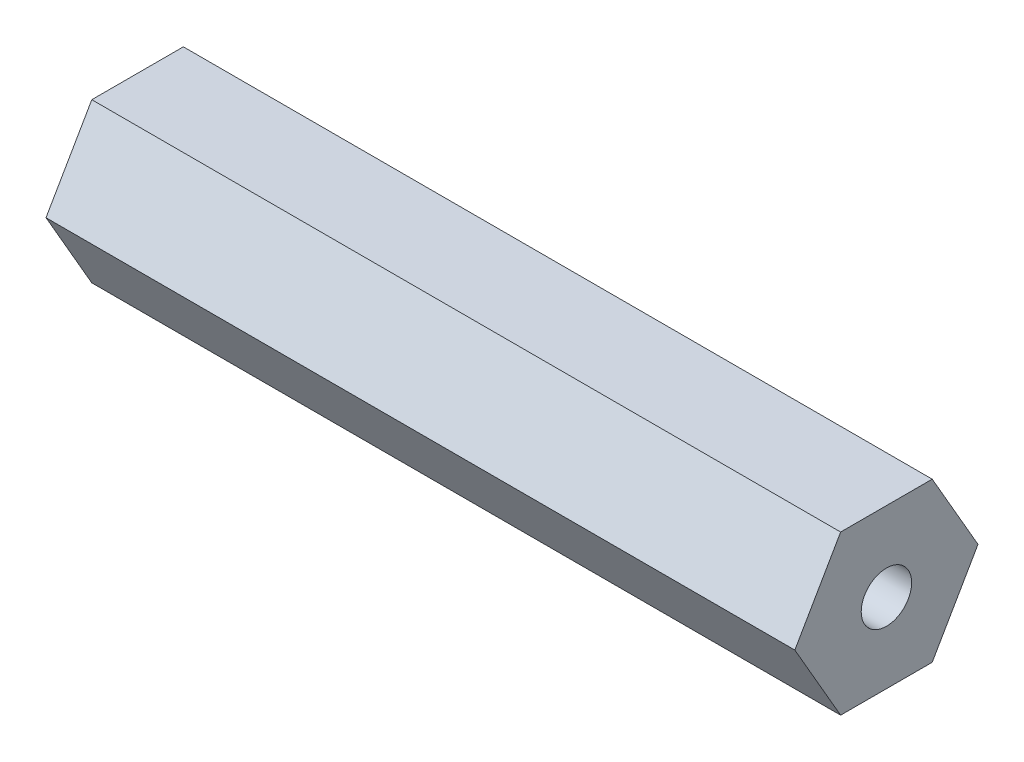
ISO-10303-21;
HEADER;
FILE_DESCRIPTION(('STEP AP214'),'2;1');
FILE_NAME('part.step','',(''),(''),'','','');
FILE_SCHEMA(('AUTOMOTIVE_DESIGN { 1 0 10303 214 1 1 1 1 }'));
ENDSEC;
DATA;
#1=APPLICATION_CONTEXT('core data for automotive mechanical design processes');
#2=APPLICATION_PROTOCOL_DEFINITION('international standard','automotive_design',2000,#1);
#3=PRODUCT_CONTEXT('',#1,'mechanical');
#4=PRODUCT('Part','Part','',(#3));
#5=PRODUCT_RELATED_PRODUCT_CATEGORY('part','',(#4));
#6=PRODUCT_DEFINITION_FORMATION('','',#4);
#7=PRODUCT_DEFINITION_CONTEXT('part definition',#1,'design');
#8=PRODUCT_DEFINITION('design','',#6,#7);
#9=PRODUCT_DEFINITION_SHAPE('','',#8);
#10=(LENGTH_UNIT() NAMED_UNIT(*) SI_UNIT(.MILLI.,.METRE.));
#11=(NAMED_UNIT(*) PLANE_ANGLE_UNIT() SI_UNIT($,.RADIAN.));
#12=(NAMED_UNIT(*) SI_UNIT($,.STERADIAN.) SOLID_ANGLE_UNIT());
#13=UNCERTAINTY_MEASURE_WITH_UNIT(LENGTH_MEASURE(1.E-05),#10,'distance_accuracy_value','');
#14=(GEOMETRIC_REPRESENTATION_CONTEXT(3) GLOBAL_UNCERTAINTY_ASSIGNED_CONTEXT((#13)) GLOBAL_UNIT_ASSIGNED_CONTEXT((#10,
#11,#12)) REPRESENTATION_CONTEXT('',''));
#15=CARTESIAN_POINT('',(0.,0.,0.));
#16=DIRECTION('',(0.,0.,1.));
#17=DIRECTION('',(1.,0.,0.));
#18=AXIS2_PLACEMENT_3D('',#15,#16,#17);
#19=CARTESIAN_POINT('',(59.9567,0.,0.));
#20=DIRECTION('',(1.,0.,0.));
#21=DIRECTION('',(0.,0.,-1.));
#22=AXIS2_PLACEMENT_3D('',#19,#20,#21);
#23=PLANE('',#22);
#24=DIRECTION('',(0.,0.866025403784442,-0.499999999999994));
#25=VECTOR('',#24,1.);
#26=CARTESIAN_POINT('',(59.9567,-6.34999999999998,-3.66617420935417));
#27=LINE('',#26,#25);
#28=CARTESIAN_POINT('',(59.9567,-6.34999999999998,-3.66617420935417));
#29=VERTEX_POINT('',#28);
#30=CARTESIAN_POINT('',(59.9567,0.,-7.33234841870825));
#31=VERTEX_POINT('',#30);
#32=EDGE_CURVE('E129',#29,#31,#27,.T.);
#33=ORIENTED_EDGE('',*,*,#32,.T.);
#34=DIRECTION('',(0.,0.866025403784435,0.500000000000006));
#35=VECTOR('',#34,1.);
#36=CARTESIAN_POINT('',(59.9567,0.,-7.33234841870825));
#37=LINE('',#36,#35);
#38=CARTESIAN_POINT('',(59.9567,6.35000000000002,-3.66617420935408));
#39=VERTEX_POINT('',#38);
#40=EDGE_CURVE('E87',#31,#39,#37,.T.);
#41=ORIENTED_EDGE('',*,*,#40,.T.);
#42=DIRECTION('',(0.,0.,1.));
#43=VECTOR('',#42,1.);
#44=CARTESIAN_POINT('',(59.9567,6.35000000000002,-3.66617420935408));
#45=LINE('',#44,#43);
#46=CARTESIAN_POINT('',(59.9567,6.34999999999997,3.66617420935417));
#47=VERTEX_POINT('',#46);
#48=EDGE_CURVE('E100',#39,#47,#45,.T.);
#49=ORIENTED_EDGE('',*,*,#48,.T.);
#50=DIRECTION('',(0.,-0.866025403784442,0.499999999999994));
#51=VECTOR('',#50,1.);
#52=CARTESIAN_POINT('',(59.9567,6.34999999999997,3.66617420935417));
#53=LINE('',#52,#51);
#54=CARTESIAN_POINT('',(59.9567,0.,7.33234841870825));
#55=VERTEX_POINT('',#54);
#56=EDGE_CURVE('E94',#47,#55,#53,.T.);
#57=ORIENTED_EDGE('',*,*,#56,.T.);
#58=DIRECTION('',(0.,-0.866025403784435,-0.500000000000006));
#59=VECTOR('',#58,1.);
#60=CARTESIAN_POINT('',(59.9567,0.,7.33234841870825));
#61=LINE('',#60,#59);
#62=CARTESIAN_POINT('',(59.9567,-6.35000000000003,3.66617420935408));
#63=VERTEX_POINT('',#62);
#64=EDGE_CURVE('E98',#55,#63,#61,.T.);
#65=ORIENTED_EDGE('',*,*,#64,.T.);
#66=DIRECTION('',(0.,0.,-1.));
#67=VECTOR('',#66,1.);
#68=CARTESIAN_POINT('',(59.9567,-6.35000000000003,3.66617420935408));
#69=LINE('',#68,#67);
#70=EDGE_CURVE('E50',#63,#29,#69,.T.);
#71=ORIENTED_EDGE('',*,*,#70,.T.);
#72=EDGE_LOOP('',(#33,#41,#49,#57,#65,#71));
#73=FACE_BOUND('',#72,.T.);
#74=CARTESIAN_POINT('',(59.9567,0.,0.));
#75=DIRECTION('',(1.,0.,0.));
#76=DIRECTION('',(0.,0.,-1.));
#77=AXIS2_PLACEMENT_3D('',#74,#75,#76);
#78=CIRCLE('',#77,2.0193);
#79=CARTESIAN_POINT('',(59.9567,0.,2.0193));
#80=VERTEX_POINT('',#79);
#81=EDGE_CURVE('E122',#80,#80,#78,.T.);
#82=ORIENTED_EDGE('',*,*,#81,.F.);
#83=EDGE_LOOP('',(#82));
#84=FACE_BOUND('',#83,.T.);
#85=ADVANCED_FACE('F33',(#73,#84),#23,.T.);
#86=CARTESIAN_POINT('',(0.,0.,0.));
#87=DIRECTION('',(1.,0.,0.));
#88=DIRECTION('',(0.,0.,-1.));
#89=AXIS2_PLACEMENT_3D('',#86,#87,#88);
#90=PLANE('',#89);
#91=DIRECTION('',(0.,0.866025403784442,-0.499999999999994));
#92=VECTOR('',#91,1.);
#93=CARTESIAN_POINT('',(0.,-6.34999999999998,-3.66617420935417));
#94=LINE('',#93,#92);
#95=CARTESIAN_POINT('',(0.,-6.34999999999998,-3.66617420935417));
#96=VERTEX_POINT('',#95);
#97=CARTESIAN_POINT('',(0.,0.,-7.33234841870825));
#98=VERTEX_POINT('',#97);
#99=EDGE_CURVE('E118',#96,#98,#94,.T.);
#100=ORIENTED_EDGE('',*,*,#99,.F.);
#101=DIRECTION('',(0.,0.,-1.));
#102=VECTOR('',#101,1.);
#103=CARTESIAN_POINT('',(0.,-6.35000000000003,3.66617420935408));
#104=LINE('',#103,#102);
#105=CARTESIAN_POINT('',(0.,-6.35000000000003,3.66617420935408));
#106=VERTEX_POINT('',#105);
#107=EDGE_CURVE('E79',#106,#96,#104,.T.);
#108=ORIENTED_EDGE('',*,*,#107,.F.);
#109=DIRECTION('',(0.,-0.866025403784435,-0.500000000000006));
#110=VECTOR('',#109,1.);
#111=CARTESIAN_POINT('',(0.,0.,7.33234841870825));
#112=LINE('',#111,#110);
#113=CARTESIAN_POINT('',(0.,0.,7.33234841870825));
#114=VERTEX_POINT('',#113);
#115=EDGE_CURVE('E73',#114,#106,#112,.T.);
#116=ORIENTED_EDGE('',*,*,#115,.F.);
#117=DIRECTION('',(0.,-0.866025403784442,0.499999999999994));
#118=VECTOR('',#117,1.);
#119=CARTESIAN_POINT('',(0.,6.34999999999997,3.66617420935417));
#120=LINE('',#119,#118);
#121=CARTESIAN_POINT('',(0.,6.34999999999997,3.66617420935417));
#122=VERTEX_POINT('',#121);
#123=EDGE_CURVE('E108',#122,#114,#120,.T.);
#124=ORIENTED_EDGE('',*,*,#123,.F.);
#125=DIRECTION('',(0.,0.,1.));
#126=VECTOR('',#125,1.);
#127=CARTESIAN_POINT('',(0.,6.35000000000002,-3.66617420935408));
#128=LINE('',#127,#126);
#129=CARTESIAN_POINT('',(0.,6.35000000000002,-3.66617420935408));
#130=VERTEX_POINT('',#129);
#131=EDGE_CURVE('E124',#130,#122,#128,.T.);
#132=ORIENTED_EDGE('',*,*,#131,.F.);
#133=DIRECTION('',(0.,0.866025403784435,0.500000000000006));
#134=VECTOR('',#133,1.);
#135=CARTESIAN_POINT('',(0.,0.,-7.33234841870825));
#136=LINE('',#135,#134);
#137=EDGE_CURVE('E121',#98,#130,#136,.T.);
#138=ORIENTED_EDGE('',*,*,#137,.F.);
#139=EDGE_LOOP('',(#100,#108,#116,#124,#132,#138));
#140=FACE_BOUND('',#139,.T.);
#141=CARTESIAN_POINT('',(0.,0.,0.));
#142=DIRECTION('',(1.,0.,0.));
#143=DIRECTION('',(0.,0.,-1.));
#144=AXIS2_PLACEMENT_3D('',#141,#142,#143);
#145=CIRCLE('',#144,2.0193);
#146=CARTESIAN_POINT('',(0.,0.,2.0193));
#147=VERTEX_POINT('',#146);
#148=EDGE_CURVE('E222',#147,#147,#145,.T.);
#149=ORIENTED_EDGE('',*,*,#148,.T.);
#150=EDGE_LOOP('',(#149));
#151=FACE_BOUND('',#150,.T.);
#152=ADVANCED_FACE('F138',(#140,#151),#90,.F.);
#153=CARTESIAN_POINT('',(59.9567,-6.34999999999998,-3.66617420935417));
#154=DIRECTION('',(0.,0.499999999999994,0.866025403784442));
#155=DIRECTION('',(0.,-0.866025403784442,0.499999999999994));
#156=AXIS2_PLACEMENT_3D('',#153,#154,#155);
#157=PLANE('',#156);
#158=ORIENTED_EDGE('',*,*,#99,.T.);
#159=DIRECTION('',(-1.,0.,0.));
#160=VECTOR('',#159,1.);
#161=CARTESIAN_POINT('',(59.9567,0.,-7.33234841870825));
#162=LINE('',#161,#160);
#163=EDGE_CURVE('E11',#31,#98,#162,.T.);
#164=ORIENTED_EDGE('',*,*,#163,.F.);
#165=ORIENTED_EDGE('',*,*,#32,.F.);
#166=DIRECTION('',(-1.,0.,0.));
#167=VECTOR('',#166,1.);
#168=CARTESIAN_POINT('',(59.9567,-6.34999999999998,-3.66617420935417));
#169=LINE('',#168,#167);
#170=EDGE_CURVE('E114',#29,#96,#169,.T.);
#171=ORIENTED_EDGE('',*,*,#170,.T.);
#172=EDGE_LOOP('',(#158,#164,#165,#171));
#173=FACE_BOUND('',#172,.T.);
#174=ADVANCED_FACE('F35',(#173),#157,.F.);
#175=CARTESIAN_POINT('',(59.9567,0.,-7.33234841870825));
#176=DIRECTION('',(0.,-0.500000000000006,0.866025403784435));
#177=DIRECTION('',(0.,-0.866025403784435,-0.500000000000006));
#178=AXIS2_PLACEMENT_3D('',#175,#176,#177);
#179=PLANE('',#178);
#180=ORIENTED_EDGE('',*,*,#137,.T.);
#181=DIRECTION('',(-1.,0.,0.));
#182=VECTOR('',#181,1.);
#183=CARTESIAN_POINT('',(59.9567,6.35000000000002,-3.66617420935408));
#184=LINE('',#183,#182);
#185=EDGE_CURVE('E42',#39,#130,#184,.T.);
#186=ORIENTED_EDGE('',*,*,#185,.F.);
#187=ORIENTED_EDGE('',*,*,#40,.F.);
#188=ORIENTED_EDGE('',*,*,#163,.T.);
#189=EDGE_LOOP('',(#180,#186,#187,#188));
#190=FACE_BOUND('',#189,.T.);
#191=ADVANCED_FACE('F163',(#190),#179,.F.);
#192=CARTESIAN_POINT('',(59.9567,6.35000000000002,-3.66617420935408));
#193=DIRECTION('',(0.,-1.,0.));
#194=DIRECTION('',(0.,0.,-1.));
#195=AXIS2_PLACEMENT_3D('',#192,#193,#194);
#196=PLANE('',#195);
#197=ORIENTED_EDGE('',*,*,#131,.T.);
#198=DIRECTION('',(-1.,0.,0.));
#199=VECTOR('',#198,1.);
#200=CARTESIAN_POINT('',(59.9567,6.34999999999997,3.66617420935417));
#201=LINE('',#200,#199);
#202=EDGE_CURVE('E109',#47,#122,#201,.T.);
#203=ORIENTED_EDGE('',*,*,#202,.F.);
#204=ORIENTED_EDGE('',*,*,#48,.F.);
#205=ORIENTED_EDGE('',*,*,#185,.T.);
#206=EDGE_LOOP('',(#197,#203,#204,#205));
#207=FACE_BOUND('',#206,.T.);
#208=ADVANCED_FACE('F135',(#207),#196,.F.);
#209=CARTESIAN_POINT('',(59.9567,6.34999999999997,3.66617420935417));
#210=DIRECTION('',(0.,-0.499999999999994,-0.866025403784442));
#211=DIRECTION('',(0.,0.866025403784442,-0.499999999999994));
#212=AXIS2_PLACEMENT_3D('',#209,#210,#211);
#213=PLANE('',#212);
#214=ORIENTED_EDGE('',*,*,#123,.T.);
#215=DIRECTION('',(-1.,0.,0.));
#216=VECTOR('',#215,1.);
#217=CARTESIAN_POINT('',(59.9567,0.,7.33234841870825));
#218=LINE('',#217,#216);
#219=EDGE_CURVE('E105',#55,#114,#218,.T.);
#220=ORIENTED_EDGE('',*,*,#219,.F.);
#221=ORIENTED_EDGE('',*,*,#56,.F.);
#222=ORIENTED_EDGE('',*,*,#202,.T.);
#223=EDGE_LOOP('',(#214,#220,#221,#222));
#224=FACE_BOUND('',#223,.T.);
#225=ADVANCED_FACE('F106',(#224),#213,.F.);
#226=CARTESIAN_POINT('',(59.9567,0.,7.33234841870825));
#227=DIRECTION('',(0.,0.500000000000006,-0.866025403784435));
#228=DIRECTION('',(0.,0.866025403784435,0.500000000000006));
#229=AXIS2_PLACEMENT_3D('',#226,#227,#228);
#230=PLANE('',#229);
#231=ORIENTED_EDGE('',*,*,#115,.T.);
#232=DIRECTION('',(-1.,0.,0.));
#233=VECTOR('',#232,1.);
#234=CARTESIAN_POINT('',(59.9567,-6.35000000000003,3.66617420935408));
#235=LINE('',#234,#233);
#236=EDGE_CURVE('E110',#63,#106,#235,.T.);
#237=ORIENTED_EDGE('',*,*,#236,.F.);
#238=ORIENTED_EDGE('',*,*,#64,.F.);
#239=ORIENTED_EDGE('',*,*,#219,.T.);
#240=EDGE_LOOP('',(#231,#237,#238,#239));
#241=FACE_BOUND('',#240,.T.);
#242=ADVANCED_FACE('F112',(#241),#230,.F.);
#243=CARTESIAN_POINT('',(59.9567,-6.35000000000003,3.66617420935408));
#244=DIRECTION('',(0.,1.,0.));
#245=DIRECTION('',(0.,0.,1.));
#246=AXIS2_PLACEMENT_3D('',#243,#244,#245);
#247=PLANE('',#246);
#248=ORIENTED_EDGE('',*,*,#107,.T.);
#249=ORIENTED_EDGE('',*,*,#170,.F.);
#250=ORIENTED_EDGE('',*,*,#70,.F.);
#251=ORIENTED_EDGE('',*,*,#236,.T.);
#252=EDGE_LOOP('',(#248,#249,#250,#251));
#253=FACE_BOUND('',#252,.T.);
#254=ADVANCED_FACE('F143',(#253),#247,.F.);
#255=CARTESIAN_POINT('',(59.9567,0.,0.));
#256=DIRECTION('',(-1.,0.,0.));
#257=DIRECTION('',(0.,0.,1.));
#258=AXIS2_PLACEMENT_3D('',#255,#256,#257);
#259=CYLINDRICAL_SURFACE('',#258,2.0193);
#260=CARTESIAN_POINT('',(59.9567,0.,2.0193));
#261=CARTESIAN_POINT('',(59.3321510416667,0.,2.0193));
#262=CARTESIAN_POINT('',(58.7076020833333,0.,2.0193));
#263=CARTESIAN_POINT('',(57.4585041666667,0.,2.0193));
#264=CARTESIAN_POINT('',(56.8339552083333,0.,2.0193));
#265=CARTESIAN_POINT('',(55.5848572916667,0.,2.0193));
#266=CARTESIAN_POINT('',(54.9603083333333,0.,2.0193));
#267=CARTESIAN_POINT('',(53.7112104166667,0.,2.0193));
#268=CARTESIAN_POINT('',(53.0866614583333,0.,2.0193));
#269=CARTESIAN_POINT('',(51.8375635416667,0.,2.0193));
#270=CARTESIAN_POINT('',(51.2130145833333,0.,2.0193));
#271=CARTESIAN_POINT('',(49.9639166666667,0.,2.0193));
#272=CARTESIAN_POINT('',(49.3393677083333,0.,2.0193));
#273=CARTESIAN_POINT('',(48.0902697916667,0.,2.0193));
#274=CARTESIAN_POINT('',(47.4657208333333,0.,2.0193));
#275=CARTESIAN_POINT('',(46.2166229166667,0.,2.0193));
#276=CARTESIAN_POINT('',(45.5920739583333,0.,2.0193));
#277=CARTESIAN_POINT('',(44.3429760416667,0.,2.0193));
#278=CARTESIAN_POINT('',(43.7184270833333,0.,2.0193));
#279=CARTESIAN_POINT('',(42.4693291666667,0.,2.0193));
#280=CARTESIAN_POINT('',(41.8447802083333,0.,2.0193));
#281=CARTESIAN_POINT('',(40.5956822916667,0.,2.0193));
#282=CARTESIAN_POINT('',(39.9711333333333,0.,2.0193));
#283=CARTESIAN_POINT('',(38.7220354166667,0.,2.0193));
#284=CARTESIAN_POINT('',(38.0974864583333,0.,2.0193));
#285=CARTESIAN_POINT('',(36.8483885416667,0.,2.0193));
#286=CARTESIAN_POINT('',(36.2238395833333,0.,2.0193));
#287=CARTESIAN_POINT('',(34.9747416666667,0.,2.0193));
#288=CARTESIAN_POINT('',(34.3501927083333,0.,2.0193));
#289=CARTESIAN_POINT('',(33.1010947916667,0.,2.0193));
#290=CARTESIAN_POINT('',(32.4765458333333,0.,2.0193));
#291=CARTESIAN_POINT('',(31.2274479166667,0.,2.0193));
#292=CARTESIAN_POINT('',(30.6028989583333,0.,2.0193));
#293=CARTESIAN_POINT('',(29.3538010416667,0.,2.0193));
#294=CARTESIAN_POINT('',(28.7292520833333,0.,2.0193));
#295=CARTESIAN_POINT('',(27.4801541666667,0.,2.0193));
#296=CARTESIAN_POINT('',(26.8556052083333,0.,2.0193));
#297=CARTESIAN_POINT('',(25.6065072916667,0.,2.0193));
#298=CARTESIAN_POINT('',(24.9819583333333,0.,2.0193));
#299=CARTESIAN_POINT('',(23.7328604166667,0.,2.0193));
#300=CARTESIAN_POINT('',(23.1083114583333,0.,2.0193));
#301=CARTESIAN_POINT('',(21.8592135416667,0.,2.0193));
#302=CARTESIAN_POINT('',(21.2346645833333,0.,2.0193));
#303=CARTESIAN_POINT('',(19.9855666666667,0.,2.0193));
#304=CARTESIAN_POINT('',(19.3610177083333,0.,2.0193));
#305=CARTESIAN_POINT('',(18.1119197916667,0.,2.0193));
#306=CARTESIAN_POINT('',(17.4873708333333,0.,2.0193));
#307=CARTESIAN_POINT('',(16.2382729166667,0.,2.0193));
#308=CARTESIAN_POINT('',(15.6137239583333,0.,2.0193));
#309=CARTESIAN_POINT('',(14.3646260416667,0.,2.0193));
#310=CARTESIAN_POINT('',(13.7400770833333,0.,2.0193));
#311=CARTESIAN_POINT('',(12.4909791666667,0.,2.0193));
#312=CARTESIAN_POINT('',(11.8664302083333,0.,2.0193));
#313=CARTESIAN_POINT('',(10.6173322916667,0.,2.0193));
#314=CARTESIAN_POINT('',(9.99278333333333,0.,2.0193));
#315=CARTESIAN_POINT('',(8.74368541666666,0.,2.0193));
#316=CARTESIAN_POINT('',(8.11913645833333,0.,2.0193));
#317=CARTESIAN_POINT('',(6.87003854166666,0.,2.0193));
#318=CARTESIAN_POINT('',(6.24548958333333,0.,2.0193));
#319=CARTESIAN_POINT('',(4.99639166666666,0.,2.0193));
#320=CARTESIAN_POINT('',(4.37184270833333,0.,2.0193));
#321=CARTESIAN_POINT('',(3.12274479166666,0.,2.0193));
#322=CARTESIAN_POINT('',(2.49819583333333,0.,2.0193));
#323=CARTESIAN_POINT('',(1.24909791666666,0.,2.0193));
#324=CARTESIAN_POINT('',(0.624548958333327,0.,2.0193));
#325=CARTESIAN_POINT('',(0.,0.,2.0193));
#326=B_SPLINE_CURVE_WITH_KNOTS('',3,(#260,#261,#262,#263,#264,#265,#266,#267,#268,#269,#270,
#271,#272,#273,#274,#275,#276,#277,#278,#279,#280,#281,#282,#283,#284,#285,#286,#287,#288,#289,
#290,#291,#292,#293,#294,#295,#296,#297,#298,#299,#300,#301,#302,#303,#304,#305,#306,#307,#308,
#309,#310,#311,#312,#313,#314,#315,#316,#317,#318,#319,#320,#321,#322,#323,#324,#325),
.UNSPECIFIED.,.F.,.F.,(4,2,2,2,2,2,2,2,2,2,2,2,2,2,2,2,2,2,2,2,2,2,2,2,2,2,2,2,2,2,2,2,4),(0.,
1.873646875,3.74729375,5.62094062499999,7.4945875,9.368234375,11.24188125,13.115528125,
14.989175,16.862821875,18.73646875,20.610115625,22.4837625,24.357409375,26.23105625,
28.104703125,29.97835,31.851996875,33.72564375,35.599290625,37.4729375,39.346584375,41.22023125,
43.093878125,44.967525,46.841171875,48.71481875,50.588465625,52.4621125,54.335759375,
56.20940625,58.083053125,59.9567),.UNSPECIFIED.);
#327=EDGE_CURVE('BSEAM145',#80,#147,#326,.T.);
#328=ORIENTED_EDGE('',*,*,#81,.T.);
#329=ORIENTED_EDGE('',*,*,#148,.F.);
#330=ORIENTED_EDGE('',*,*,#327,.T.);
#331=ORIENTED_EDGE('',*,*,#327,.F.);
#332=EDGE_LOOP('',(#328,#330,#329,#331));
#333=FACE_BOUND('',#332,.T.);
#334=ADVANCED_FACE('F145',(#333),#259,.F.);
#335=CLOSED_SHELL('',(#85,#152,#174,#191,#208,#225,#242,#254,#334));
#336=MANIFOLD_SOLID_BREP('B2',#335);
#337=ADVANCED_BREP_SHAPE_REPRESENTATION('',(#18,#336),#14);
#338=SHAPE_DEFINITION_REPRESENTATION(#9,#337);
ENDSEC;
END-ISO-10303-21;
